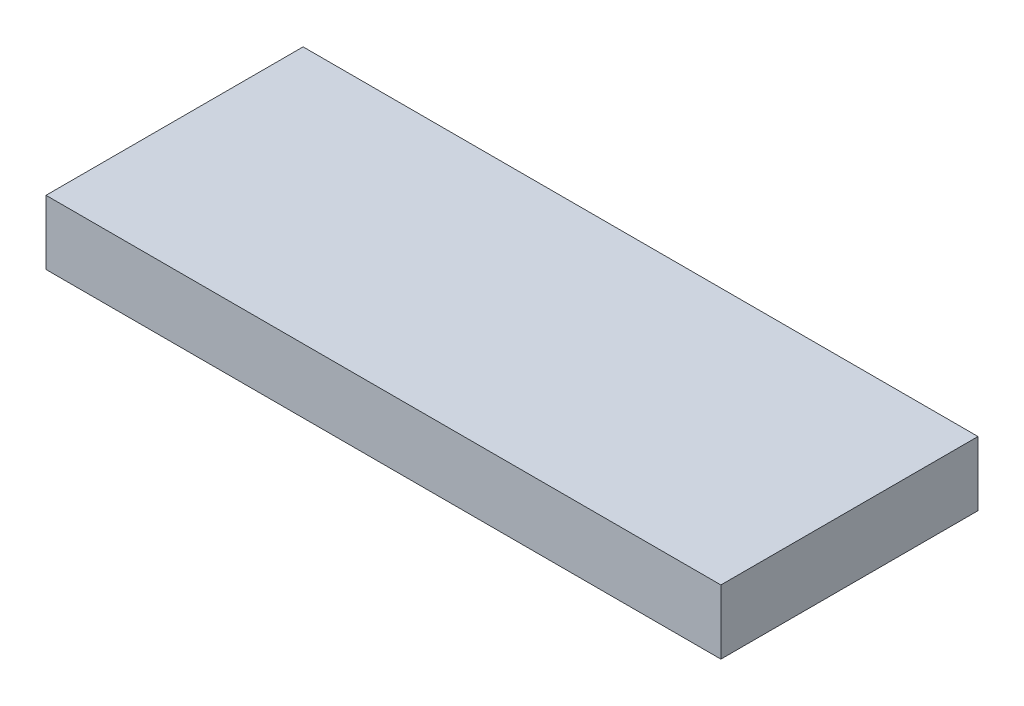
ISO-10303-21;
HEADER;
FILE_DESCRIPTION(('STEP AP214'),'2;1');
FILE_NAME('part.step','',(''),(''),'','','');
FILE_SCHEMA(('AUTOMOTIVE_DESIGN { 1 0 10303 214 1 1 1 1 }'));
ENDSEC;
DATA;
#1=APPLICATION_CONTEXT('core data for automotive mechanical design processes');
#2=APPLICATION_PROTOCOL_DEFINITION('international standard','automotive_design',2000,#1);
#3=PRODUCT_CONTEXT('',#1,'mechanical');
#4=PRODUCT('Part','Part','',(#3));
#5=PRODUCT_RELATED_PRODUCT_CATEGORY('part','',(#4));
#6=PRODUCT_DEFINITION_FORMATION('','',#4);
#7=PRODUCT_DEFINITION_CONTEXT('part definition',#1,'design');
#8=PRODUCT_DEFINITION('design','',#6,#7);
#9=PRODUCT_DEFINITION_SHAPE('','',#8);
#10=(LENGTH_UNIT() NAMED_UNIT(*) SI_UNIT(.MILLI.,.METRE.));
#11=(NAMED_UNIT(*) PLANE_ANGLE_UNIT() SI_UNIT($,.RADIAN.));
#12=(NAMED_UNIT(*) SI_UNIT($,.STERADIAN.) SOLID_ANGLE_UNIT());
#13=UNCERTAINTY_MEASURE_WITH_UNIT(LENGTH_MEASURE(1.E-05),#10,'distance_accuracy_value','');
#14=(GEOMETRIC_REPRESENTATION_CONTEXT(3) GLOBAL_UNCERTAINTY_ASSIGNED_CONTEXT((#13)) GLOBAL_UNIT_ASSIGNED_CONTEXT((#10,
#11,#12)) REPRESENTATION_CONTEXT('',''));
#15=CARTESIAN_POINT('',(0.,0.,0.));
#16=DIRECTION('',(0.,0.,1.));
#17=DIRECTION('',(1.,0.,0.));
#18=AXIS2_PLACEMENT_3D('',#15,#16,#17);
#19=CARTESIAN_POINT('',(66.675,12.7,-25.4));
#20=DIRECTION('',(-1.,0.,0.));
#21=DIRECTION('',(0.,0.,1.));
#22=AXIS2_PLACEMENT_3D('',#19,#20,#21);
#23=PLANE('',#22);
#24=DIRECTION('',(0.,0.,-1.));
#25=VECTOR('',#24,1.);
#26=CARTESIAN_POINT('',(66.675,0.,-25.4));
#27=LINE('',#26,#25);
#28=CARTESIAN_POINT('',(66.675,0.,25.4));
#29=VERTEX_POINT('',#28);
#30=CARTESIAN_POINT('',(66.675,0.,-25.4));
#31=VERTEX_POINT('',#30);
#32=EDGE_CURVE('E96',#29,#31,#27,.T.);
#33=ORIENTED_EDGE('',*,*,#32,.T.);
#34=DIRECTION('',(0.,-1.,0.));
#35=VECTOR('',#34,1.);
#36=CARTESIAN_POINT('',(66.675,12.7,-25.4));
#37=LINE('',#36,#35);
#38=CARTESIAN_POINT('',(66.675,12.7,-25.4));
#39=VERTEX_POINT('',#38);
#40=EDGE_CURVE('E11',#39,#31,#37,.T.);
#41=ORIENTED_EDGE('',*,*,#40,.F.);
#42=DIRECTION('',(0.,0.,-1.));
#43=VECTOR('',#42,1.);
#44=CARTESIAN_POINT('',(66.675,12.7,-25.4));
#45=LINE('',#44,#43);
#46=CARTESIAN_POINT('',(66.675,12.7,25.4));
#47=VERTEX_POINT('',#46);
#48=EDGE_CURVE('E84',#47,#39,#45,.T.);
#49=ORIENTED_EDGE('',*,*,#48,.F.);
#50=DIRECTION('',(0.,-1.,0.));
#51=VECTOR('',#50,1.);
#52=CARTESIAN_POINT('',(66.675,12.7,25.4));
#53=LINE('',#52,#51);
#54=EDGE_CURVE('E92',#47,#29,#53,.T.);
#55=ORIENTED_EDGE('',*,*,#54,.T.);
#56=EDGE_LOOP('',(#33,#41,#49,#55));
#57=FACE_BOUND('',#56,.T.);
#58=ADVANCED_FACE('F33',(#57),#23,.F.);
#59=CARTESIAN_POINT('',(-66.675,12.7,-25.4));
#60=DIRECTION('',(0.,0.,1.));
#61=DIRECTION('',(1.,0.,0.));
#62=AXIS2_PLACEMENT_3D('',#59,#60,#61);
#63=PLANE('',#62);
#64=DIRECTION('',(-1.,0.,0.));
#65=VECTOR('',#64,1.);
#66=CARTESIAN_POINT('',(-66.675,0.,-25.4));
#67=LINE('',#66,#65);
#68=CARTESIAN_POINT('',(-66.675,0.,-25.4));
#69=VERTEX_POINT('',#68);
#70=EDGE_CURVE('E88',#31,#69,#67,.T.);
#71=ORIENTED_EDGE('',*,*,#70,.T.);
#72=DIRECTION('',(0.,-1.,0.));
#73=VECTOR('',#72,1.);
#74=CARTESIAN_POINT('',(-66.675,12.7,-25.4));
#75=LINE('',#74,#73);
#76=CARTESIAN_POINT('',(-66.675,12.7,-25.4));
#77=VERTEX_POINT('',#76);
#78=EDGE_CURVE('E41',#77,#69,#75,.T.);
#79=ORIENTED_EDGE('',*,*,#78,.F.);
#80=DIRECTION('',(-1.,0.,0.));
#81=VECTOR('',#80,1.);
#82=CARTESIAN_POINT('',(-66.675,12.7,-25.4));
#83=LINE('',#82,#81);
#84=EDGE_CURVE('E79',#39,#77,#83,.T.);
#85=ORIENTED_EDGE('',*,*,#84,.F.);
#86=ORIENTED_EDGE('',*,*,#40,.T.);
#87=EDGE_LOOP('',(#71,#79,#85,#86));
#88=FACE_BOUND('',#87,.T.);
#89=ADVANCED_FACE('F87',(#88),#63,.F.);
#90=CARTESIAN_POINT('',(-66.675,12.7,-25.4));
#91=DIRECTION('',(1.,0.,0.));
#92=DIRECTION('',(0.,0.,-1.));
#93=AXIS2_PLACEMENT_3D('',#90,#91,#92);
#94=PLANE('',#93);
#95=DIRECTION('',(0.,0.,1.));
#96=VECTOR('',#95,1.);
#97=CARTESIAN_POINT('',(-66.675,0.,-25.4));
#98=LINE('',#97,#96);
#99=CARTESIAN_POINT('',(-66.675,0.,25.4));
#100=VERTEX_POINT('',#99);
#101=EDGE_CURVE('E66',#69,#100,#98,.T.);
#102=ORIENTED_EDGE('',*,*,#101,.T.);
#103=DIRECTION('',(0.,-1.,0.));
#104=VECTOR('',#103,1.);
#105=CARTESIAN_POINT('',(-66.675,12.7,25.4));
#106=LINE('',#105,#104);
#107=CARTESIAN_POINT('',(-66.675,12.7,25.4));
#108=VERTEX_POINT('',#107);
#109=EDGE_CURVE('E89',#108,#100,#106,.T.);
#110=ORIENTED_EDGE('',*,*,#109,.F.);
#111=DIRECTION('',(0.,0.,1.));
#112=VECTOR('',#111,1.);
#113=CARTESIAN_POINT('',(-66.675,12.7,-25.4));
#114=LINE('',#113,#112);
#115=EDGE_CURVE('E82',#77,#108,#114,.T.);
#116=ORIENTED_EDGE('',*,*,#115,.F.);
#117=ORIENTED_EDGE('',*,*,#78,.T.);
#118=EDGE_LOOP('',(#102,#110,#116,#117));
#119=FACE_BOUND('',#118,.T.);
#120=ADVANCED_FACE('F90',(#119),#94,.F.);
#121=CARTESIAN_POINT('',(-66.675,12.7,25.4));
#122=DIRECTION('',(0.,0.,-1.));
#123=DIRECTION('',(-1.,0.,0.));
#124=AXIS2_PLACEMENT_3D('',#121,#122,#123);
#125=PLANE('',#124);
#126=DIRECTION('',(1.,0.,0.));
#127=VECTOR('',#126,1.);
#128=CARTESIAN_POINT('',(-66.675,0.,25.4));
#129=LINE('',#128,#127);
#130=EDGE_CURVE('E72',#100,#29,#129,.T.);
#131=ORIENTED_EDGE('',*,*,#130,.T.);
#132=ORIENTED_EDGE('',*,*,#54,.F.);
#133=DIRECTION('',(1.,0.,0.));
#134=VECTOR('',#133,1.);
#135=CARTESIAN_POINT('',(-66.675,12.7,25.4));
#136=LINE('',#135,#134);
#137=EDGE_CURVE('E49',#108,#47,#136,.T.);
#138=ORIENTED_EDGE('',*,*,#137,.F.);
#139=ORIENTED_EDGE('',*,*,#109,.T.);
#140=EDGE_LOOP('',(#131,#132,#138,#139));
#141=FACE_BOUND('',#140,.T.);
#142=ADVANCED_FACE('F103',(#141),#125,.F.);
#143=CARTESIAN_POINT('',(0.,12.7,0.));
#144=DIRECTION('',(0.,1.,0.));
#145=DIRECTION('',(0.,0.,1.));
#146=AXIS2_PLACEMENT_3D('',#143,#144,#145);
#147=PLANE('',#146);
#148=ORIENTED_EDGE('',*,*,#48,.T.);
#149=ORIENTED_EDGE('',*,*,#84,.T.);
#150=ORIENTED_EDGE('',*,*,#115,.T.);
#151=ORIENTED_EDGE('',*,*,#137,.T.);
#152=EDGE_LOOP('',(#148,#149,#150,#151));
#153=FACE_BOUND('',#152,.T.);
#154=ADVANCED_FACE('F80',(#153),#147,.T.);
#155=CARTESIAN_POINT('',(0.,0.,0.));
#156=DIRECTION('',(0.,1.,0.));
#157=DIRECTION('',(0.,0.,1.));
#158=AXIS2_PLACEMENT_3D('',#155,#156,#157);
#159=PLANE('',#158);
#160=ORIENTED_EDGE('',*,*,#32,.F.);
#161=ORIENTED_EDGE('',*,*,#130,.F.);
#162=ORIENTED_EDGE('',*,*,#101,.F.);
#163=ORIENTED_EDGE('',*,*,#70,.F.);
#164=EDGE_LOOP('',(#160,#161,#162,#163));
#165=FACE_BOUND('',#164,.T.);
#166=ADVANCED_FACE('F106',(#165),#159,.F.);
#167=CLOSED_SHELL('',(#58,#89,#120,#142,#154,#166));
#168=MANIFOLD_SOLID_BREP('B2',#167);
#169=ADVANCED_BREP_SHAPE_REPRESENTATION('',(#18,#168),#14);
#170=SHAPE_DEFINITION_REPRESENTATION(#9,#169);
ENDSEC;
END-ISO-10303-21;
